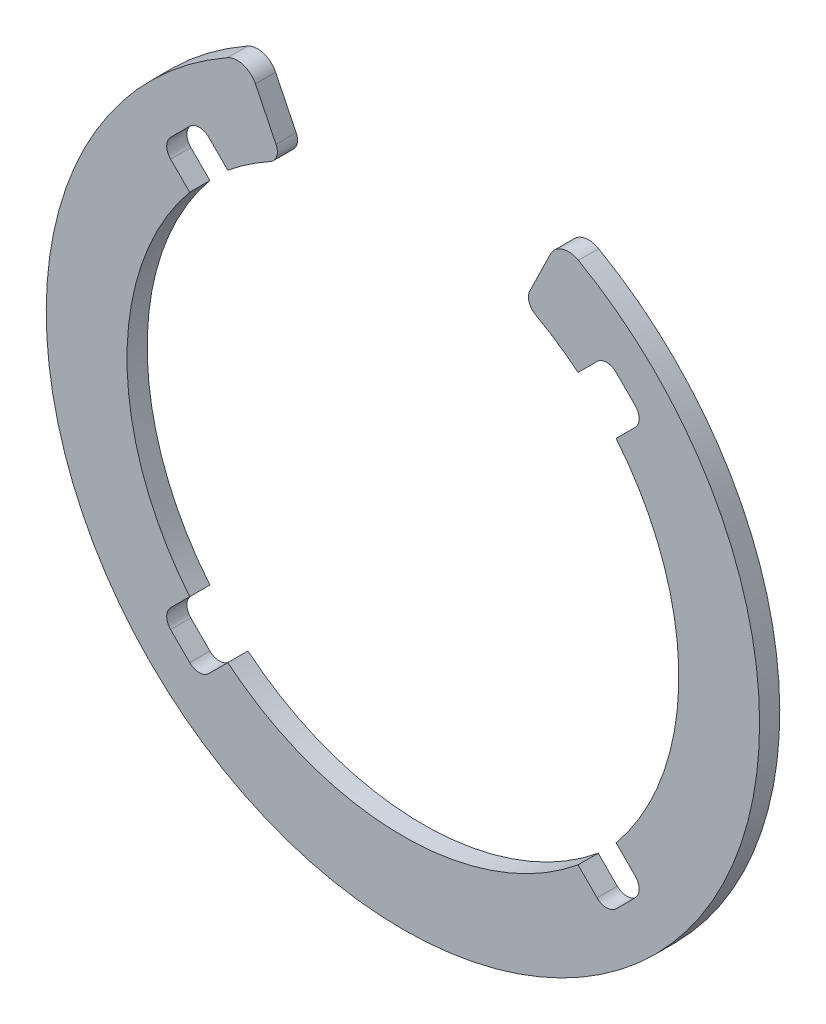
ISO-10303-21;
HEADER;
FILE_DESCRIPTION(('STEP AP214'),'2;1');
FILE_NAME('part.step','',(''),(''),'','','');
FILE_SCHEMA(('AUTOMOTIVE_DESIGN { 1 0 10303 214 1 1 1 1 }'));
ENDSEC;
DATA;
#1=APPLICATION_CONTEXT('core data for automotive mechanical design processes');
#2=APPLICATION_PROTOCOL_DEFINITION('international standard','automotive_design',2000,#1);
#3=PRODUCT_CONTEXT('',#1,'mechanical');
#4=PRODUCT('Part','Part','',(#3));
#5=PRODUCT_RELATED_PRODUCT_CATEGORY('part','',(#4));
#6=PRODUCT_DEFINITION_FORMATION('','',#4);
#7=PRODUCT_DEFINITION_CONTEXT('part definition',#1,'design');
#8=PRODUCT_DEFINITION('design','',#6,#7);
#9=PRODUCT_DEFINITION_SHAPE('','',#8);
#10=(LENGTH_UNIT() NAMED_UNIT(*) SI_UNIT(.MILLI.,.METRE.));
#11=(NAMED_UNIT(*) PLANE_ANGLE_UNIT() SI_UNIT($,.RADIAN.));
#12=(NAMED_UNIT(*) SI_UNIT($,.STERADIAN.) SOLID_ANGLE_UNIT());
#13=UNCERTAINTY_MEASURE_WITH_UNIT(LENGTH_MEASURE(1.E-05),#10,'distance_accuracy_value','');
#14=(GEOMETRIC_REPRESENTATION_CONTEXT(3) GLOBAL_UNCERTAINTY_ASSIGNED_CONTEXT((#13)) GLOBAL_UNIT_ASSIGNED_CONTEXT((#10,
#11,#12)) REPRESENTATION_CONTEXT('',''));
#15=CARTESIAN_POINT('',(0.,0.,0.));
#16=DIRECTION('',(0.,0.,1.));
#17=DIRECTION('',(1.,0.,0.));
#18=AXIS2_PLACEMENT_3D('',#15,#16,#17);
#19=CARTESIAN_POINT('',(0.,0.,3.));
#20=DIRECTION('',(0.,0.,-1.));
#21=DIRECTION('',(-1.,0.,0.));
#22=AXIS2_PLACEMENT_3D('',#19,#20,#21);
#23=CYLINDRICAL_SURFACE('',#22,41.);
#24=CARTESIAN_POINT('',(0.,0.,3.));
#25=DIRECTION('',(0.,0.,1.));
#26=DIRECTION('',(1.,0.,0.));
#27=AXIS2_PLACEMENT_3D('',#24,#25,#26);
#28=CIRCLE('',#27,41.);
#29=CARTESIAN_POINT('',(26.0246489677607,31.6815032172533,3.));
#30=VERTEX_POINT('',#29);
#31=CARTESIAN_POINT('',(19.6938906800581,35.9604041951967,3.));
#32=VERTEX_POINT('',#31);
#33=EDGE_CURVE('E280',#30,#32,#28,.T.);
#34=ORIENTED_EDGE('',*,*,#33,.T.);
#35=DIRECTION('',(0.,0.,-1.));
#36=VECTOR('',#35,1.);
#37=CARTESIAN_POINT('',(19.6938906800581,35.9604041951967,3.));
#38=LINE('',#37,#36);
#39=CARTESIAN_POINT('',(19.6938906800581,35.9604041951967,0.));
#40=VERTEX_POINT('',#39);
#41=EDGE_CURVE('E362',#32,#40,#38,.T.);
#42=ORIENTED_EDGE('',*,*,#41,.T.);
#43=CARTESIAN_POINT('',(0.,0.,0.));
#44=DIRECTION('',(0.,0.,1.));
#45=DIRECTION('',(1.,0.,0.));
#46=AXIS2_PLACEMENT_3D('',#43,#44,#45);
#47=CIRCLE('',#46,41.);
#48=CARTESIAN_POINT('',(26.0246489677607,31.6815032172533,0.));
#49=VERTEX_POINT('',#48);
#50=EDGE_CURVE('E277',#49,#40,#47,.T.);
#51=ORIENTED_EDGE('',*,*,#50,.F.);
#52=DIRECTION('',(0.,0.,1.));
#53=VECTOR('',#52,1.);
#54=CARTESIAN_POINT('',(26.0246489677607,31.6815032172533,0.));
#55=LINE('',#54,#53);
#56=EDGE_CURVE('E426',#49,#30,#55,.T.);
#57=ORIENTED_EDGE('',*,*,#56,.T.);
#58=EDGE_LOOP('',(#34,#42,#51,#57));
#59=FACE_BOUND('',#58,.T.);
#60=ADVANCED_FACE('F33',(#59),#23,.F.);
#61=CARTESIAN_POINT('',(-19.6938906800581,35.9604041951967,0.));
#62=VERTEX_POINT('',#61);
#63=CARTESIAN_POINT('',(-26.0246489677607,31.6815032172533,0.));
#64=VERTEX_POINT('',#63);
#65=EDGE_CURVE('E275',#62,#64,#47,.T.);
#66=ORIENTED_EDGE('',*,*,#65,.F.);
#67=DIRECTION('',(0.,0.,-1.));
#68=VECTOR('',#67,1.);
#69=CARTESIAN_POINT('',(-19.6938906800581,35.9604041951967,3.));
#70=LINE('',#69,#68);
#71=CARTESIAN_POINT('',(-19.6938906800581,35.9604041951967,3.));
#72=VERTEX_POINT('',#71);
#73=EDGE_CURVE('E367',#62,#72,#70,.F.);
#74=ORIENTED_EDGE('',*,*,#73,.T.);
#75=CARTESIAN_POINT('',(-26.0246489677607,31.6815032172533,3.));
#76=VERTEX_POINT('',#75);
#77=EDGE_CURVE('E290',#72,#76,#28,.T.);
#78=ORIENTED_EDGE('',*,*,#77,.T.);
#79=DIRECTION('',(0.,0.,1.));
#80=VECTOR('',#79,1.);
#81=CARTESIAN_POINT('',(-26.0246489677607,31.6815032172533,0.));
#82=LINE('',#81,#80);
#83=EDGE_CURVE('E507',#64,#76,#82,.T.);
#84=ORIENTED_EDGE('',*,*,#83,.F.);
#85=EDGE_LOOP('',(#66,#74,#78,#84));
#86=FACE_BOUND('',#85,.T.);
#87=ADVANCED_FACE('F497',(#86),#23,.F.);
#88=DIRECTION('',(0.,0.,1.));
#89=VECTOR('',#88,1.);
#90=CARTESIAN_POINT('',(-26.0246489677607,-31.6815032172533,0.));
#91=LINE('',#90,#89);
#92=CARTESIAN_POINT('',(-26.0246489677607,-31.6815032172533,0.));
#93=VERTEX_POINT('',#92);
#94=CARTESIAN_POINT('',(-26.0246489677607,-31.6815032172533,3.));
#95=VERTEX_POINT('',#94);
#96=EDGE_CURVE('E259',#93,#95,#91,.T.);
#97=ORIENTED_EDGE('',*,*,#96,.T.);
#98=CARTESIAN_POINT('',(26.0246489677607,-31.6815032172533,3.));
#99=VERTEX_POINT('',#98);
#100=EDGE_CURVE('E546',#95,#99,#28,.T.);
#101=ORIENTED_EDGE('',*,*,#100,.T.);
#102=DIRECTION('',(0.,0.,1.));
#103=VECTOR('',#102,1.);
#104=CARTESIAN_POINT('',(26.0246489677607,-31.6815032172533,0.));
#105=LINE('',#104,#103);
#106=CARTESIAN_POINT('',(26.0246489677607,-31.6815032172533,0.));
#107=VERTEX_POINT('',#106);
#108=EDGE_CURVE('E270',#107,#99,#105,.T.);
#109=ORIENTED_EDGE('',*,*,#108,.F.);
#110=EDGE_CURVE('E248',#93,#107,#47,.T.);
#111=ORIENTED_EDGE('',*,*,#110,.F.);
#112=EDGE_LOOP('',(#97,#101,#109,#111));
#113=FACE_BOUND('',#112,.T.);
#114=ADVANCED_FACE('F269',(#113),#23,.F.);
#115=DIRECTION('',(0.,0.,1.));
#116=VECTOR('',#115,1.);
#117=CARTESIAN_POINT('',(31.6815032172532,26.0246489677608,0.));
#118=LINE('',#117,#116);
#119=CARTESIAN_POINT('',(31.6815032172532,26.0246489677608,0.));
#120=VERTEX_POINT('',#119);
#121=CARTESIAN_POINT('',(31.6815032172532,26.0246489677608,3.));
#122=VERTEX_POINT('',#121);
#123=EDGE_CURVE('E428',#120,#122,#118,.T.);
#124=ORIENTED_EDGE('',*,*,#123,.F.);
#125=CARTESIAN_POINT('',(31.6815032172532,-26.0246489677608,0.));
#126=VERTEX_POINT('',#125);
#127=EDGE_CURVE('E272',#126,#120,#47,.T.);
#128=ORIENTED_EDGE('',*,*,#127,.F.);
#129=DIRECTION('',(0.,0.,1.));
#130=VECTOR('',#129,1.);
#131=CARTESIAN_POINT('',(31.6815032172532,-26.0246489677608,0.));
#132=LINE('',#131,#130);
#133=CARTESIAN_POINT('',(31.6815032172532,-26.0246489677608,3.));
#134=VERTEX_POINT('',#133);
#135=EDGE_CURVE('E443',#126,#134,#132,.T.);
#136=ORIENTED_EDGE('',*,*,#135,.T.);
#137=EDGE_CURVE('E543',#134,#122,#28,.T.);
#138=ORIENTED_EDGE('',*,*,#137,.T.);
#139=EDGE_LOOP('',(#124,#128,#136,#138));
#140=FACE_BOUND('',#139,.T.);
#141=ADVANCED_FACE('F542',(#140),#23,.F.);
#142=CARTESIAN_POINT('',(0.,0.,3.));
#143=DIRECTION('',(0.,0.,1.));
#144=DIRECTION('',(1.,0.,0.));
#145=AXIS2_PLACEMENT_3D('',#142,#143,#144);
#146=PLANE('',#145);
#147=DIRECTION('',(0.439024390243903,0.898475144214335,0.));
#148=VECTOR('',#147,1.);
#149=CARTESIAN_POINT('',(18.,36.8374809127877,3.));
#150=LINE('',#149,#148);
#151=CARTESIAN_POINT('',(18.8576179857786,38.5926190339868,3.));
#152=VERTEX_POINT('',#151);
#153=CARTESIAN_POINT('',(21.9116716919434,44.8428215399576,3.));
#154=VERTEX_POINT('',#153);
#155=EDGE_CURVE('E295',#152,#154,#150,.T.);
#156=ORIENTED_EDGE('',*,*,#155,.F.);
#157=CARTESIAN_POINT('',(20.6545682742073,37.714570253499,3.));
#158=DIRECTION('',(0.,0.,1.));
#159=DIRECTION('',(1.,0.,0.));
#160=AXIS2_PLACEMENT_3D('',#157,#158,#159);
#161=CIRCLE('',#160,2.);
#162=EDGE_CURVE('E360',#152,#32,#161,.T.);
#163=ORIENTED_EDGE('',*,*,#162,.T.);
#164=ORIENTED_EDGE('',*,*,#33,.F.);
#165=DIRECTION('',(-0.707106781186564,-0.707106781186531,0.));
#166=VECTOR('',#165,1.);
#167=CARTESIAN_POINT('',(-2.8284271247469,2.82842712474703,3.));
#168=LINE('',#167,#166);
#169=CARTESIAN_POINT('',(28.853076092507,34.5099303419995,3.));
#170=VERTEX_POINT('',#169);
#171=EDGE_CURVE('E405',#170,#30,#168,.T.);
#172=ORIENTED_EDGE('',*,*,#171,.F.);
#173=CARTESIAN_POINT('',(30.26728965488,33.0957167796263,3.));
#174=DIRECTION('',(0.,0.,1.));
#175=DIRECTION('',(1.,0.,0.));
#176=AXIS2_PLACEMENT_3D('',#173,#174,#175);
#177=CIRCLE('',#176,2.);
#178=CARTESIAN_POINT('',(31.6815032172531,34.5099303419994,3.));
#179=VERTEX_POINT('',#178);
#180=EDGE_CURVE('E41',#170,#179,#177,.F.);
#181=ORIENTED_EDGE('',*,*,#180,.T.);
#182=DIRECTION('',(-0.70710678118655,0.707106781186545,0.));
#183=VECTOR('',#182,1.);
#184=CARTESIAN_POINT('',(33.0957167796262,33.0957167796264,3.));
#185=LINE('',#184,#183);
#186=CARTESIAN_POINT('',(34.5099303419994,31.6815032172532,3.));
#187=VERTEX_POINT('',#186);
#188=EDGE_CURVE('E403',#187,#179,#185,.T.);
#189=ORIENTED_EDGE('',*,*,#188,.F.);
#190=CARTESIAN_POINT('',(33.0957167796263,30.2672896548801,3.));
#191=DIRECTION('',(0.,0.,1.));
#192=DIRECTION('',(1.,0.,0.));
#193=AXIS2_PLACEMENT_3D('',#190,#191,#192);
#194=CIRCLE('',#193,2.);
#195=CARTESIAN_POINT('',(34.5099303419994,28.853076092507,3.));
#196=VERTEX_POINT('',#195);
#197=EDGE_CURVE('E394',#187,#196,#194,.F.);
#198=ORIENTED_EDGE('',*,*,#197,.T.);
#199=DIRECTION('',(0.707106781186544,0.707106781186551,0.));
#200=VECTOR('',#199,1.);
#201=CARTESIAN_POINT('',(2.82842712474634,-2.82842712474631,3.));
#202=LINE('',#201,#200);
#203=EDGE_CURVE('E461',#122,#196,#202,.T.);
#204=ORIENTED_EDGE('',*,*,#203,.F.);
#205=ORIENTED_EDGE('',*,*,#137,.F.);
#206=DIRECTION('',(-0.707106781186547,0.707106781186548,0.));
#207=VECTOR('',#206,1.);
#208=CARTESIAN_POINT('',(2.82842712474622,2.82842712474621,3.));
#209=LINE('',#208,#207);
#210=CARTESIAN_POINT('',(34.5099303419994,-28.853076092507,3.));
#211=VERTEX_POINT('',#210);
#212=EDGE_CURVE('E450',#211,#134,#209,.T.);
#213=ORIENTED_EDGE('',*,*,#212,.F.);
#214=CARTESIAN_POINT('',(33.0957167796263,-30.2672896548801,3.));
#215=DIRECTION('',(0.,0.,1.));
#216=DIRECTION('',(1.,0.,0.));
#217=AXIS2_PLACEMENT_3D('',#214,#215,#216);
#218=CIRCLE('',#217,2.);
#219=CARTESIAN_POINT('',(34.5099303419994,-31.6815032172532,3.));
#220=VERTEX_POINT('',#219);
#221=EDGE_CURVE('E375',#211,#220,#218,.F.);
#222=ORIENTED_EDGE('',*,*,#221,.T.);
#223=DIRECTION('',(0.70710678118655,0.707106781186545,0.));
#224=VECTOR('',#223,1.);
#225=CARTESIAN_POINT('',(33.0957167796262,-33.0957167796264,3.));
#226=LINE('',#225,#224);
#227=CARTESIAN_POINT('',(31.6815032172532,-34.5099303419994,3.));
#228=VERTEX_POINT('',#227);
#229=EDGE_CURVE('E465',#228,#220,#226,.T.);
#230=ORIENTED_EDGE('',*,*,#229,.F.);
#231=CARTESIAN_POINT('',(30.2672896548801,-33.0957167796263,3.));
#232=DIRECTION('',(0.,0.,1.));
#233=DIRECTION('',(1.,0.,0.));
#234=AXIS2_PLACEMENT_3D('',#231,#232,#233);
#235=CIRCLE('',#234,2.);
#236=CARTESIAN_POINT('',(28.853076092507,-34.5099303419995,3.));
#237=VERTEX_POINT('',#236);
#238=EDGE_CURVE('E371',#228,#237,#235,.F.);
#239=ORIENTED_EDGE('',*,*,#238,.T.);
#240=DIRECTION('',(0.707106781186564,-0.707106781186531,0.));
#241=VECTOR('',#240,1.);
#242=CARTESIAN_POINT('',(-2.82842712474689,-2.82842712474702,3.));
#243=LINE('',#242,#241);
#244=EDGE_CURVE('E445',#99,#237,#243,.T.);
#245=ORIENTED_EDGE('',*,*,#244,.F.);
#246=ORIENTED_EDGE('',*,*,#100,.F.);
#247=DIRECTION('',(0.707106781186564,0.707106781186531,0.));
#248=VECTOR('',#247,1.);
#249=CARTESIAN_POINT('',(2.82842712474689,-2.82842712474702,3.));
#250=LINE('',#249,#248);
#251=CARTESIAN_POINT('',(-28.853076092507,-34.5099303419995,3.));
#252=VERTEX_POINT('',#251);
#253=EDGE_CURVE('E262',#252,#95,#250,.T.);
#254=ORIENTED_EDGE('',*,*,#253,.F.);
#255=CARTESIAN_POINT('',(-30.2672896548801,-33.0957167796263,3.));
#256=DIRECTION('',(0.,0.,1.));
#257=DIRECTION('',(1.,0.,0.));
#258=AXIS2_PLACEMENT_3D('',#255,#256,#257);
#259=CIRCLE('',#258,2.);
#260=CARTESIAN_POINT('',(-31.6815032172531,-34.5099303419994,3.));
#261=VERTEX_POINT('',#260);
#262=EDGE_CURVE('E379',#252,#261,#259,.F.);
#263=ORIENTED_EDGE('',*,*,#262,.T.);
#264=DIRECTION('',(0.70710678118655,-0.707106781186545,0.));
#265=VECTOR('',#264,1.);
#266=CARTESIAN_POINT('',(-33.0957167796262,-33.0957167796264,3.));
#267=LINE('',#266,#265);
#268=CARTESIAN_POINT('',(-34.5099303419994,-31.6815032172532,3.));
#269=VERTEX_POINT('',#268);
#270=EDGE_CURVE('E468',#269,#261,#267,.T.);
#271=ORIENTED_EDGE('',*,*,#270,.F.);
#272=CARTESIAN_POINT('',(-33.0957167796263,-30.2672896548801,3.));
#273=DIRECTION('',(0.,0.,1.));
#274=DIRECTION('',(1.,0.,0.));
#275=AXIS2_PLACEMENT_3D('',#272,#273,#274);
#276=CIRCLE('',#275,2.);
#277=CARTESIAN_POINT('',(-34.5099303419994,-28.853076092507,3.));
#278=VERTEX_POINT('',#277);
#279=EDGE_CURVE('E382',#269,#278,#276,.F.);
#280=ORIENTED_EDGE('',*,*,#279,.T.);
#281=DIRECTION('',(-0.707106781186546,-0.70710678118655,0.));
#282=VECTOR('',#281,1.);
#283=CARTESIAN_POINT('',(-2.82842712474628,2.82842712474626,3.));
#284=LINE('',#283,#282);
#285=CARTESIAN_POINT('',(-31.6815032172532,-26.0246489677608,3.));
#286=VERTEX_POINT('',#285);
#287=EDGE_CURVE('E452',#286,#278,#284,.T.);
#288=ORIENTED_EDGE('',*,*,#287,.F.);
#289=CARTESIAN_POINT('',(-31.6815032172532,26.0246489677608,3.));
#290=VERTEX_POINT('',#289);
#291=EDGE_CURVE('E292',#290,#286,#28,.T.);
#292=ORIENTED_EDGE('',*,*,#291,.F.);
#293=DIRECTION('',(0.707106781186546,-0.70710678118655,0.));
#294=VECTOR('',#293,1.);
#295=CARTESIAN_POINT('',(-2.82842712474628,-2.82842712474626,3.));
#296=LINE('',#295,#294);
#297=CARTESIAN_POINT('',(-34.5099303419994,28.853076092507,3.));
#298=VERTEX_POINT('',#297);
#299=EDGE_CURVE('E456',#298,#290,#296,.T.);
#300=ORIENTED_EDGE('',*,*,#299,.F.);
#301=CARTESIAN_POINT('',(-33.0957167796263,30.2672896548801,3.));
#302=DIRECTION('',(0.,0.,1.));
#303=DIRECTION('',(1.,0.,0.));
#304=AXIS2_PLACEMENT_3D('',#301,#302,#303);
#305=CIRCLE('',#304,2.);
#306=CARTESIAN_POINT('',(-34.5099303419994,31.6815032172532,3.));
#307=VERTEX_POINT('',#306);
#308=EDGE_CURVE('E386',#298,#307,#305,.F.);
#309=ORIENTED_EDGE('',*,*,#308,.T.);
#310=DIRECTION('',(-0.70710678118655,-0.707106781186545,0.));
#311=VECTOR('',#310,1.);
#312=CARTESIAN_POINT('',(-33.0957167796262,33.0957167796264,3.));
#313=LINE('',#312,#311);
#314=CARTESIAN_POINT('',(-31.6815032172531,34.5099303419994,3.));
#315=VERTEX_POINT('',#314);
#316=EDGE_CURVE('E415',#315,#307,#313,.T.);
#317=ORIENTED_EDGE('',*,*,#316,.F.);
#318=CARTESIAN_POINT('',(-30.2672896548801,33.0957167796263,3.));
#319=DIRECTION('',(0.,0.,1.));
#320=DIRECTION('',(1.,0.,0.));
#321=AXIS2_PLACEMENT_3D('',#318,#319,#320);
#322=CIRCLE('',#321,2.);
#323=CARTESIAN_POINT('',(-28.853076092507,34.5099303419995,3.));
#324=VERTEX_POINT('',#323);
#325=EDGE_CURVE('E390',#315,#324,#322,.F.);
#326=ORIENTED_EDGE('',*,*,#325,.T.);
#327=DIRECTION('',(-0.707106781186564,0.707106781186531,0.));
#328=VECTOR('',#327,1.);
#329=CARTESIAN_POINT('',(2.82842712474689,2.82842712474702,3.));
#330=LINE('',#329,#328);
#331=EDGE_CURVE('E458',#76,#324,#330,.T.);
#332=ORIENTED_EDGE('',*,*,#331,.F.);
#333=ORIENTED_EDGE('',*,*,#77,.F.);
#334=CARTESIAN_POINT('',(-20.6545682742073,37.714570253499,3.));
#335=DIRECTION('',(0.,0.,1.));
#336=DIRECTION('',(1.,0.,0.));
#337=AXIS2_PLACEMENT_3D('',#334,#335,#336);
#338=CIRCLE('',#337,2.);
#339=CARTESIAN_POINT('',(-18.8576179857786,38.5926190339868,3.));
#340=VERTEX_POINT('',#339);
#341=EDGE_CURVE('E358',#72,#340,#338,.T.);
#342=ORIENTED_EDGE('',*,*,#341,.T.);
#343=DIRECTION('',(0.439024390243903,-0.898475144214335,0.));
#344=VECTOR('',#343,1.);
#345=CARTESIAN_POINT('',(-18.,36.8374809127877,3.));
#346=LINE('',#345,#344);
#347=CARTESIAN_POINT('',(-21.9116716919434,44.8428215399576,3.));
#348=VERTEX_POINT('',#347);
#349=EDGE_CURVE('E293',#348,#340,#346,.T.);
#350=ORIENTED_EDGE('',*,*,#349,.F.);
#351=CARTESIAN_POINT('',(-24.6070971245864,43.5257483692259,3.));
#352=DIRECTION('',(0.,0.,1.));
#353=DIRECTION('',(1.,0.,0.));
#354=AXIS2_PLACEMENT_3D('',#351,#352,#353);
#355=CIRCLE('',#354,3.);
#356=CARTESIAN_POINT('',(-26.0835229520616,46.1372932713795,3.));
#357=VERTEX_POINT('',#356);
#358=EDGE_CURVE('E301',#348,#357,#355,.T.);
#359=ORIENTED_EDGE('',*,*,#358,.T.);
#360=CARTESIAN_POINT('',(0.,0.,3.));
#361=DIRECTION('',(0.,0.,1.));
#362=DIRECTION('',(1.,0.,0.));
#363=AXIS2_PLACEMENT_3D('',#360,#361,#362);
#364=CIRCLE('',#363,53.);
#365=CARTESIAN_POINT('',(26.0835229520616,46.1372932713795,3.));
#366=VERTEX_POINT('',#365);
#367=EDGE_CURVE('E283',#357,#366,#364,.T.);
#368=ORIENTED_EDGE('',*,*,#367,.T.);
#369=CARTESIAN_POINT('',(24.6070971245864,43.5257483692259,3.));
#370=DIRECTION('',(0.,0.,1.));
#371=DIRECTION('',(1.,0.,0.));
#372=AXIS2_PLACEMENT_3D('',#369,#370,#371);
#373=CIRCLE('',#372,3.);
#374=EDGE_CURVE('E303',#366,#154,#373,.T.);
#375=ORIENTED_EDGE('',*,*,#374,.T.);
#376=EDGE_LOOP('',(#156,#163,#164,#172,#181,#189,#198,#204,#205,#213,#222,#230,#239,#245,#246,
#254,#263,#271,#280,#288,#292,#300,#309,#317,#326,#332,#333,#342,#350,#359,#368,#375));
#377=FACE_BOUND('',#376,.T.);
#378=ADVANCED_FACE('F402',(#377),#146,.T.);
#379=CARTESIAN_POINT('',(0.,0.,0.));
#380=DIRECTION('',(0.,0.,1.));
#381=DIRECTION('',(1.,0.,0.));
#382=AXIS2_PLACEMENT_3D('',#379,#380,#381);
#383=PLANE('',#382);
#384=ORIENTED_EDGE('',*,*,#50,.T.);
#385=CARTESIAN_POINT('',(20.6545682742073,37.714570253499,0.));
#386=DIRECTION('',(0.,0.,1.));
#387=DIRECTION('',(1.,0.,0.));
#388=AXIS2_PLACEMENT_3D('',#385,#386,#387);
#389=CIRCLE('',#388,2.);
#390=CARTESIAN_POINT('',(18.8576179857786,38.5926190339868,0.));
#391=VERTEX_POINT('',#390);
#392=EDGE_CURVE('E365',#40,#391,#389,.F.);
#393=ORIENTED_EDGE('',*,*,#392,.T.);
#394=DIRECTION('',(0.439024390243902,0.898475144214335,0.));
#395=VECTOR('',#394,1.);
#396=CARTESIAN_POINT('',(18.,36.8374809127877,0.));
#397=LINE('',#396,#395);
#398=CARTESIAN_POINT('',(21.9116716919434,44.8428215399576,0.));
#399=VERTEX_POINT('',#398);
#400=EDGE_CURVE('E281',#391,#399,#397,.T.);
#401=ORIENTED_EDGE('',*,*,#400,.T.);
#402=CARTESIAN_POINT('',(24.6070971245864,43.5257483692259,0.));
#403=DIRECTION('',(0.,0.,1.));
#404=DIRECTION('',(1.,0.,0.));
#405=AXIS2_PLACEMENT_3D('',#402,#403,#404);
#406=CIRCLE('',#405,3.);
#407=CARTESIAN_POINT('',(26.0835229520616,46.1372932713795,0.));
#408=VERTEX_POINT('',#407);
#409=EDGE_CURVE('E311',#399,#408,#406,.F.);
#410=ORIENTED_EDGE('',*,*,#409,.T.);
#411=CARTESIAN_POINT('',(0.,0.,0.));
#412=DIRECTION('',(0.,0.,1.));
#413=DIRECTION('',(1.,0.,0.));
#414=AXIS2_PLACEMENT_3D('',#411,#412,#413);
#415=CIRCLE('',#414,53.);
#416=CARTESIAN_POINT('',(-26.0835229520616,46.1372932713795,0.));
#417=VERTEX_POINT('',#416);
#418=EDGE_CURVE('E287',#417,#408,#415,.T.);
#419=ORIENTED_EDGE('',*,*,#418,.F.);
#420=CARTESIAN_POINT('',(-24.6070971245864,43.5257483692259,0.));
#421=DIRECTION('',(0.,0.,1.));
#422=DIRECTION('',(1.,0.,0.));
#423=AXIS2_PLACEMENT_3D('',#420,#421,#422);
#424=CIRCLE('',#423,3.);
#425=CARTESIAN_POINT('',(-21.9116716919434,44.8428215399576,0.));
#426=VERTEX_POINT('',#425);
#427=EDGE_CURVE('E309',#417,#426,#424,.F.);
#428=ORIENTED_EDGE('',*,*,#427,.T.);
#429=DIRECTION('',(0.439024390243902,-0.898475144214335,0.));
#430=VECTOR('',#429,1.);
#431=CARTESIAN_POINT('',(-18.,36.8374809127877,0.));
#432=LINE('',#431,#430);
#433=CARTESIAN_POINT('',(-18.8576179857786,38.5926190339868,0.));
#434=VERTEX_POINT('',#433);
#435=EDGE_CURVE('E414',#426,#434,#432,.T.);
#436=ORIENTED_EDGE('',*,*,#435,.T.);
#437=CARTESIAN_POINT('',(-20.6545682742073,37.714570253499,0.));
#438=DIRECTION('',(0.,0.,1.));
#439=DIRECTION('',(1.,0.,0.));
#440=AXIS2_PLACEMENT_3D('',#437,#438,#439);
#441=CIRCLE('',#440,2.);
#442=EDGE_CURVE('E48',#434,#62,#441,.F.);
#443=ORIENTED_EDGE('',*,*,#442,.T.);
#444=ORIENTED_EDGE('',*,*,#65,.T.);
#445=DIRECTION('',(-0.707106781186564,0.707106781186531,0.));
#446=VECTOR('',#445,1.);
#447=CARTESIAN_POINT('',(-26.0246489677607,31.6815032172533,0.));
#448=LINE('',#447,#446);
#449=CARTESIAN_POINT('',(-28.853076092507,34.5099303419995,0.));
#450=VERTEX_POINT('',#449);
#451=EDGE_CURVE('E435',#64,#450,#448,.T.);
#452=ORIENTED_EDGE('',*,*,#451,.T.);
#453=CARTESIAN_POINT('',(-30.2672896548801,33.0957167796263,0.));
#454=DIRECTION('',(0.,0.,1.));
#455=DIRECTION('',(1.,0.,0.));
#456=AXIS2_PLACEMENT_3D('',#453,#454,#455);
#457=CIRCLE('',#456,2.);
#458=CARTESIAN_POINT('',(-31.6815032172531,34.5099303419994,0.));
#459=VERTEX_POINT('',#458);
#460=EDGE_CURVE('E392',#450,#459,#457,.T.);
#461=ORIENTED_EDGE('',*,*,#460,.T.);
#462=DIRECTION('',(-0.70710678118655,-0.707106781186545,0.));
#463=VECTOR('',#462,1.);
#464=CARTESIAN_POINT('',(-35.9241439043725,30.2672896548801,0.));
#465=LINE('',#464,#463);
#466=CARTESIAN_POINT('',(-34.5099303419994,31.6815032172532,0.));
#467=VERTEX_POINT('',#466);
#468=EDGE_CURVE('E514',#459,#467,#465,.T.);
#469=ORIENTED_EDGE('',*,*,#468,.T.);
#470=CARTESIAN_POINT('',(-33.0957167796263,30.2672896548801,0.));
#471=DIRECTION('',(0.,0.,1.));
#472=DIRECTION('',(1.,0.,0.));
#473=AXIS2_PLACEMENT_3D('',#470,#471,#472);
#474=CIRCLE('',#473,2.);
#475=CARTESIAN_POINT('',(-34.5099303419994,28.853076092507,0.));
#476=VERTEX_POINT('',#475);
#477=EDGE_CURVE('E388',#467,#476,#474,.T.);
#478=ORIENTED_EDGE('',*,*,#477,.T.);
#479=DIRECTION('',(0.707106781186545,-0.707106781186549,0.));
#480=VECTOR('',#479,1.);
#481=CARTESIAN_POINT('',(-31.6815032172532,26.0246489677608,0.));
#482=LINE('',#481,#480);
#483=CARTESIAN_POINT('',(-31.6815032172532,26.0246489677608,0.));
#484=VERTEX_POINT('',#483);
#485=EDGE_CURVE('E519',#476,#484,#482,.T.);
#486=ORIENTED_EDGE('',*,*,#485,.T.);
#487=CARTESIAN_POINT('',(-31.6815032172532,-26.0246489677608,0.));
#488=VERTEX_POINT('',#487);
#489=EDGE_CURVE('E271',#484,#488,#47,.T.);
#490=ORIENTED_EDGE('',*,*,#489,.T.);
#491=DIRECTION('',(-0.707106781186545,-0.707106781186549,0.));
#492=VECTOR('',#491,1.);
#493=CARTESIAN_POINT('',(-31.6815032172532,-26.0246489677608,0.));
#494=LINE('',#493,#492);
#495=CARTESIAN_POINT('',(-34.5099303419994,-28.853076092507,0.));
#496=VERTEX_POINT('',#495);
#497=EDGE_CURVE('E527',#488,#496,#494,.T.);
#498=ORIENTED_EDGE('',*,*,#497,.T.);
#499=CARTESIAN_POINT('',(-33.0957167796263,-30.2672896548801,0.));
#500=DIRECTION('',(0.,0.,1.));
#501=DIRECTION('',(1.,0.,0.));
#502=AXIS2_PLACEMENT_3D('',#499,#500,#501);
#503=CIRCLE('',#502,2.);
#504=CARTESIAN_POINT('',(-34.5099303419994,-31.6815032172532,0.));
#505=VERTEX_POINT('',#504);
#506=EDGE_CURVE('E384',#496,#505,#503,.T.);
#507=ORIENTED_EDGE('',*,*,#506,.T.);
#508=DIRECTION('',(0.70710678118655,-0.707106781186545,0.));
#509=VECTOR('',#508,1.);
#510=CARTESIAN_POINT('',(-35.9241439043725,-30.2672896548801,0.));
#511=LINE('',#510,#509);
#512=CARTESIAN_POINT('',(-31.6815032172531,-34.5099303419994,0.));
#513=VERTEX_POINT('',#512);
#514=EDGE_CURVE('E256',#505,#513,#511,.T.);
#515=ORIENTED_EDGE('',*,*,#514,.T.);
#516=CARTESIAN_POINT('',(-30.2672896548801,-33.0957167796263,0.));
#517=DIRECTION('',(0.,0.,1.));
#518=DIRECTION('',(1.,0.,0.));
#519=AXIS2_PLACEMENT_3D('',#516,#517,#518);
#520=CIRCLE('',#519,2.);
#521=CARTESIAN_POINT('',(-28.853076092507,-34.5099303419995,0.));
#522=VERTEX_POINT('',#521);
#523=EDGE_CURVE('E251',#513,#522,#520,.T.);
#524=ORIENTED_EDGE('',*,*,#523,.T.);
#525=DIRECTION('',(0.707106781186564,0.707106781186531,0.));
#526=VECTOR('',#525,1.);
#527=CARTESIAN_POINT('',(-26.0246489677607,-31.6815032172533,0.));
#528=LINE('',#527,#526);
#529=EDGE_CURVE('E242',#522,#93,#528,.T.);
#530=ORIENTED_EDGE('',*,*,#529,.T.);
#531=ORIENTED_EDGE('',*,*,#110,.T.);
#532=DIRECTION('',(0.707106781186564,-0.707106781186531,0.));
#533=VECTOR('',#532,1.);
#534=CARTESIAN_POINT('',(26.0246489677607,-31.6815032172533,0.));
#535=LINE('',#534,#533);
#536=CARTESIAN_POINT('',(28.853076092507,-34.5099303419994,0.));
#537=VERTEX_POINT('',#536);
#538=EDGE_CURVE('E438',#107,#537,#535,.T.);
#539=ORIENTED_EDGE('',*,*,#538,.T.);
#540=CARTESIAN_POINT('',(30.2672896548801,-33.0957167796263,0.));
#541=DIRECTION('',(0.,0.,1.));
#542=DIRECTION('',(1.,0.,0.));
#543=AXIS2_PLACEMENT_3D('',#540,#541,#542);
#544=CIRCLE('',#543,2.);
#545=CARTESIAN_POINT('',(31.6815032172532,-34.5099303419994,0.));
#546=VERTEX_POINT('',#545);
#547=EDGE_CURVE('E373',#537,#546,#544,.T.);
#548=ORIENTED_EDGE('',*,*,#547,.T.);
#549=DIRECTION('',(0.70710678118655,0.707106781186545,0.));
#550=VECTOR('',#549,1.);
#551=CARTESIAN_POINT('',(35.9241439043725,-30.2672896548801,0.));
#552=LINE('',#551,#550);
#553=CARTESIAN_POINT('',(34.5099303419994,-31.6815032172532,0.));
#554=VERTEX_POINT('',#553);
#555=EDGE_CURVE('E440',#546,#554,#552,.T.);
#556=ORIENTED_EDGE('',*,*,#555,.T.);
#557=CARTESIAN_POINT('',(33.0957167796263,-30.2672896548801,0.));
#558=DIRECTION('',(0.,0.,1.));
#559=DIRECTION('',(1.,0.,0.));
#560=AXIS2_PLACEMENT_3D('',#557,#558,#559);
#561=CIRCLE('',#560,2.);
#562=CARTESIAN_POINT('',(34.5099303419994,-28.853076092507,0.));
#563=VERTEX_POINT('',#562);
#564=EDGE_CURVE('E377',#554,#563,#561,.T.);
#565=ORIENTED_EDGE('',*,*,#564,.T.);
#566=DIRECTION('',(-0.707106781186547,0.707106781186548,0.));
#567=VECTOR('',#566,1.);
#568=CARTESIAN_POINT('',(31.6815032172532,-26.0246489677608,0.));
#569=LINE('',#568,#567);
#570=EDGE_CURVE('E266',#563,#126,#569,.T.);
#571=ORIENTED_EDGE('',*,*,#570,.T.);
#572=ORIENTED_EDGE('',*,*,#127,.T.);
#573=DIRECTION('',(0.707106781186544,0.707106781186551,0.));
#574=VECTOR('',#573,1.);
#575=CARTESIAN_POINT('',(31.6815032172532,26.0246489677608,0.));
#576=LINE('',#575,#574);
#577=CARTESIAN_POINT('',(34.5099303419994,28.853076092507,0.));
#578=VERTEX_POINT('',#577);
#579=EDGE_CURVE('E431',#120,#578,#576,.T.);
#580=ORIENTED_EDGE('',*,*,#579,.T.);
#581=CARTESIAN_POINT('',(33.0957167796263,30.2672896548801,0.));
#582=DIRECTION('',(0.,0.,1.));
#583=DIRECTION('',(1.,0.,0.));
#584=AXIS2_PLACEMENT_3D('',#581,#582,#583);
#585=CIRCLE('',#584,2.);
#586=CARTESIAN_POINT('',(34.5099303419994,31.6815032172532,0.));
#587=VERTEX_POINT('',#586);
#588=EDGE_CURVE('E396',#578,#587,#585,.T.);
#589=ORIENTED_EDGE('',*,*,#588,.T.);
#590=DIRECTION('',(-0.70710678118655,0.707106781186545,0.));
#591=VECTOR('',#590,1.);
#592=CARTESIAN_POINT('',(35.9241439043725,30.2672896548801,0.));
#593=LINE('',#592,#591);
#594=CARTESIAN_POINT('',(31.6815032172531,34.5099303419994,0.));
#595=VERTEX_POINT('',#594);
#596=EDGE_CURVE('E422',#587,#595,#593,.T.);
#597=ORIENTED_EDGE('',*,*,#596,.T.);
#598=CARTESIAN_POINT('',(30.26728965488,33.0957167796263,0.));
#599=DIRECTION('',(0.,0.,1.));
#600=DIRECTION('',(1.,0.,0.));
#601=AXIS2_PLACEMENT_3D('',#598,#599,#600);
#602=CIRCLE('',#601,2.);
#603=CARTESIAN_POINT('',(28.853076092507,34.5099303419995,0.));
#604=VERTEX_POINT('',#603);
#605=EDGE_CURVE('E11',#595,#604,#602,.T.);
#606=ORIENTED_EDGE('',*,*,#605,.T.);
#607=DIRECTION('',(-0.707106781186564,-0.707106781186531,0.));
#608=VECTOR('',#607,1.);
#609=CARTESIAN_POINT('',(26.0246489677607,31.6815032172533,0.));
#610=LINE('',#609,#608);
#611=EDGE_CURVE('E420',#604,#49,#610,.T.);
#612=ORIENTED_EDGE('',*,*,#611,.T.);
#613=EDGE_LOOP('',(#384,#393,#401,#410,#419,#428,#436,#443,#444,#452,#461,#469,#478,#486,#490,
#498,#507,#515,#524,#530,#531,#539,#548,#556,#565,#571,#572,#580,#589,#597,#606,#612));
#614=FACE_BOUND('',#613,.T.);
#615=ADVANCED_FACE('F245',(#614),#383,.F.);
#616=CARTESIAN_POINT('',(0.,0.,3.));
#617=DIRECTION('',(0.,0.,-1.));
#618=DIRECTION('',(-1.,0.,0.));
#619=AXIS2_PLACEMENT_3D('',#616,#617,#618);
#620=CYLINDRICAL_SURFACE('',#619,53.);
#621=ORIENTED_EDGE('',*,*,#418,.T.);
#622=DIRECTION('',(0.,0.,-1.));
#623=VECTOR('',#622,1.);
#624=CARTESIAN_POINT('',(26.0835229520616,46.1372932713795,3.));
#625=LINE('',#624,#623);
#626=EDGE_CURVE('E298',#408,#366,#625,.F.);
#627=ORIENTED_EDGE('',*,*,#626,.T.);
#628=ORIENTED_EDGE('',*,*,#367,.F.);
#629=DIRECTION('',(0.,0.,-1.));
#630=VECTOR('',#629,1.);
#631=CARTESIAN_POINT('',(-26.0835229520616,46.1372932713795,3.));
#632=LINE('',#631,#630);
#633=EDGE_CURVE('E286',#357,#417,#632,.T.);
#634=ORIENTED_EDGE('',*,*,#633,.T.);
#635=EDGE_LOOP('',(#621,#627,#628,#634));
#636=FACE_BOUND('',#635,.T.);
#637=ADVANCED_FACE('F485',(#636),#620,.T.);
#638=DIRECTION('',(0.,0.,1.));
#639=VECTOR('',#638,1.);
#640=CARTESIAN_POINT('',(-31.6815032172532,26.0246489677608,0.));
#641=LINE('',#640,#639);
#642=EDGE_CURVE('E521',#484,#290,#641,.T.);
#643=ORIENTED_EDGE('',*,*,#642,.T.);
#644=ORIENTED_EDGE('',*,*,#291,.T.);
#645=DIRECTION('',(0.,0.,1.));
#646=VECTOR('',#645,1.);
#647=CARTESIAN_POINT('',(-31.6815032172532,-26.0246489677608,0.));
#648=LINE('',#647,#646);
#649=EDGE_CURVE('E255',#488,#286,#648,.T.);
#650=ORIENTED_EDGE('',*,*,#649,.F.);
#651=ORIENTED_EDGE('',*,*,#489,.F.);
#652=EDGE_LOOP('',(#643,#644,#650,#651));
#653=FACE_BOUND('',#652,.T.);
#654=ADVANCED_FACE('F560',(#653),#23,.F.);
#655=CARTESIAN_POINT('',(-18.,36.8374809127877,0.));
#656=DIRECTION('',(-0.898475144214335,-0.439024390243902,0.));
#657=DIRECTION('',(0.439024390243903,-0.898475144214335,0.));
#658=AXIS2_PLACEMENT_3D('',#655,#656,#657);
#659=PLANE('',#658);
#660=ORIENTED_EDGE('',*,*,#349,.T.);
#661=DIRECTION('',(0.,0.,1.));
#662=VECTOR('',#661,1.);
#663=CARTESIAN_POINT('',(-18.8576179857786,38.5926190339868,0.));
#664=LINE('',#663,#662);
#665=EDGE_CURVE('E56',#340,#434,#664,.F.);
#666=ORIENTED_EDGE('',*,*,#665,.T.);
#667=ORIENTED_EDGE('',*,*,#435,.F.);
#668=DIRECTION('',(0.,0.,-1.));
#669=VECTOR('',#668,1.);
#670=CARTESIAN_POINT('',(-21.9116716919434,44.8428215399576,0.));
#671=LINE('',#670,#669);
#672=EDGE_CURVE('E313',#426,#348,#671,.F.);
#673=ORIENTED_EDGE('',*,*,#672,.T.);
#674=EDGE_LOOP('',(#660,#666,#667,#673));
#675=FACE_BOUND('',#674,.T.);
#676=ADVANCED_FACE('F492',(#675),#659,.F.);
#677=CARTESIAN_POINT('',(18.,36.8374809127877,0.));
#678=DIRECTION('',(0.898475144214335,-0.439024390243902,0.));
#679=DIRECTION('',(0.439024390243903,0.898475144214335,0.));
#680=AXIS2_PLACEMENT_3D('',#677,#678,#679);
#681=PLANE('',#680);
#682=ORIENTED_EDGE('',*,*,#400,.F.);
#683=DIRECTION('',(0.,0.,1.));
#684=VECTOR('',#683,1.);
#685=CARTESIAN_POINT('',(18.8576179857786,38.5926190339868,3.));
#686=LINE('',#685,#684);
#687=EDGE_CURVE('E355',#391,#152,#686,.T.);
#688=ORIENTED_EDGE('',*,*,#687,.T.);
#689=ORIENTED_EDGE('',*,*,#155,.T.);
#690=DIRECTION('',(0.,0.,-1.));
#691=VECTOR('',#690,1.);
#692=CARTESIAN_POINT('',(21.9116716919434,44.8428215399576,0.));
#693=LINE('',#692,#691);
#694=EDGE_CURVE('E306',#154,#399,#693,.T.);
#695=ORIENTED_EDGE('',*,*,#694,.T.);
#696=EDGE_LOOP('',(#682,#688,#689,#695));
#697=FACE_BOUND('',#696,.T.);
#698=ADVANCED_FACE('F479',(#697),#681,.F.);
#699=CARTESIAN_POINT('',(31.6815032172532,-26.0246489677608,0.));
#700=DIRECTION('',(0.707106781186548,0.707106781186547,0.));
#701=DIRECTION('',(-0.707106781186547,0.707106781186548,0.));
#702=AXIS2_PLACEMENT_3D('',#699,#700,#701);
#703=PLANE('',#702);
#704=ORIENTED_EDGE('',*,*,#570,.F.);
#705=DIRECTION('',(0.,0.,1.));
#706=VECTOR('',#705,1.);
#707=CARTESIAN_POINT('',(34.5099303419994,-28.853076092507,3.));
#708=LINE('',#707,#706);
#709=EDGE_CURVE('E323',#563,#211,#708,.T.);
#710=ORIENTED_EDGE('',*,*,#709,.T.);
#711=ORIENTED_EDGE('',*,*,#212,.T.);
#712=ORIENTED_EDGE('',*,*,#135,.F.);
#713=EDGE_LOOP('',(#704,#710,#711,#712));
#714=FACE_BOUND('',#713,.T.);
#715=ADVANCED_FACE('F618',(#714),#703,.F.);
#716=CARTESIAN_POINT('',(35.9241439043725,-30.2672896548801,0.));
#717=DIRECTION('',(0.707106781186545,-0.70710678118655,0.));
#718=DIRECTION('',(0.70710678118655,0.707106781186545,0.));
#719=AXIS2_PLACEMENT_3D('',#716,#717,#718);
#720=PLANE('',#719);
#721=ORIENTED_EDGE('',*,*,#555,.F.);
#722=DIRECTION('',(0.,0.,1.));
#723=VECTOR('',#722,1.);
#724=CARTESIAN_POINT('',(31.6815032172532,-34.5099303419994,3.));
#725=LINE('',#724,#723);
#726=EDGE_CURVE('E318',#546,#228,#725,.T.);
#727=ORIENTED_EDGE('',*,*,#726,.T.);
#728=ORIENTED_EDGE('',*,*,#229,.T.);
#729=DIRECTION('',(0.,0.,1.));
#730=VECTOR('',#729,1.);
#731=CARTESIAN_POINT('',(34.5099303419994,-31.6815032172532,0.));
#732=LINE('',#731,#730);
#733=EDGE_CURVE('E316',#220,#554,#732,.F.);
#734=ORIENTED_EDGE('',*,*,#733,.T.);
#735=EDGE_LOOP('',(#721,#727,#728,#734));
#736=FACE_BOUND('',#735,.T.);
#737=ADVANCED_FACE('F628',(#736),#720,.F.);
#738=CARTESIAN_POINT('',(26.0246489677607,-31.6815032172533,0.));
#739=DIRECTION('',(-0.707106781186531,-0.707106781186564,0.));
#740=DIRECTION('',(0.707106781186564,-0.707106781186531,0.));
#741=AXIS2_PLACEMENT_3D('',#738,#739,#740);
#742=PLANE('',#741);
#743=ORIENTED_EDGE('',*,*,#244,.T.);
#744=DIRECTION('',(0.,0.,1.));
#745=VECTOR('',#744,1.);
#746=CARTESIAN_POINT('',(28.853076092507,-34.5099303419994,0.));
#747=LINE('',#746,#745);
#748=EDGE_CURVE('E321',#237,#537,#747,.F.);
#749=ORIENTED_EDGE('',*,*,#748,.T.);
#750=ORIENTED_EDGE('',*,*,#538,.F.);
#751=ORIENTED_EDGE('',*,*,#108,.T.);
#752=EDGE_LOOP('',(#743,#749,#750,#751));
#753=FACE_BOUND('',#752,.T.);
#754=ADVANCED_FACE('F638',(#753),#742,.F.);
#755=CARTESIAN_POINT('',(-26.0246489677607,-31.6815032172533,0.));
#756=DIRECTION('',(0.707106781186531,-0.707106781186564,0.));
#757=DIRECTION('',(0.707106781186564,0.707106781186531,0.));
#758=AXIS2_PLACEMENT_3D('',#755,#756,#757);
#759=PLANE('',#758);
#760=ORIENTED_EDGE('',*,*,#529,.F.);
#761=DIRECTION('',(0.,0.,1.));
#762=VECTOR('',#761,1.);
#763=CARTESIAN_POINT('',(-28.853076092507,-34.5099303419995,3.));
#764=LINE('',#763,#762);
#765=EDGE_CURVE('E326',#522,#252,#764,.T.);
#766=ORIENTED_EDGE('',*,*,#765,.T.);
#767=ORIENTED_EDGE('',*,*,#253,.T.);
#768=ORIENTED_EDGE('',*,*,#96,.F.);
#769=EDGE_LOOP('',(#760,#766,#767,#768));
#770=FACE_BOUND('',#769,.T.);
#771=ADVANCED_FACE('F260',(#770),#759,.F.);
#772=CARTESIAN_POINT('',(-35.9241439043725,-30.2672896548801,0.));
#773=DIRECTION('',(-0.707106781186545,-0.70710678118655,0.));
#774=DIRECTION('',(0.70710678118655,-0.707106781186545,0.));
#775=AXIS2_PLACEMENT_3D('',#772,#773,#774);
#776=PLANE('',#775);
#777=ORIENTED_EDGE('',*,*,#270,.T.);
#778=DIRECTION('',(0.,0.,1.));
#779=VECTOR('',#778,1.);
#780=CARTESIAN_POINT('',(-31.6815032172531,-34.5099303419994,0.));
#781=LINE('',#780,#779);
#782=EDGE_CURVE('E331',#261,#513,#781,.F.);
#783=ORIENTED_EDGE('',*,*,#782,.T.);
#784=ORIENTED_EDGE('',*,*,#514,.F.);
#785=DIRECTION('',(0.,0.,1.));
#786=VECTOR('',#785,1.);
#787=CARTESIAN_POINT('',(-34.5099303419994,-31.6815032172532,3.));
#788=LINE('',#787,#786);
#789=EDGE_CURVE('E328',#505,#269,#788,.T.);
#790=ORIENTED_EDGE('',*,*,#789,.T.);
#791=EDGE_LOOP('',(#777,#783,#784,#790));
#792=FACE_BOUND('',#791,.T.);
#793=ADVANCED_FACE('F657',(#792),#776,.F.);
#794=CARTESIAN_POINT('',(-31.6815032172532,-26.0246489677608,0.));
#795=DIRECTION('',(-0.70710678118655,0.707106781186546,0.));
#796=DIRECTION('',(-0.707106781186546,-0.70710678118655,0.));
#797=AXIS2_PLACEMENT_3D('',#794,#795,#796);
#798=PLANE('',#797);
#799=ORIENTED_EDGE('',*,*,#287,.T.);
#800=DIRECTION('',(0.,0.,1.));
#801=VECTOR('',#800,1.);
#802=CARTESIAN_POINT('',(-34.5099303419994,-28.853076092507,0.));
#803=LINE('',#802,#801);
#804=EDGE_CURVE('E333',#278,#496,#803,.F.);
#805=ORIENTED_EDGE('',*,*,#804,.T.);
#806=ORIENTED_EDGE('',*,*,#497,.F.);
#807=ORIENTED_EDGE('',*,*,#649,.T.);
#808=EDGE_LOOP('',(#799,#805,#806,#807));
#809=FACE_BOUND('',#808,.T.);
#810=ADVANCED_FACE('F666',(#809),#798,.F.);
#811=CARTESIAN_POINT('',(-26.0246489677607,31.6815032172533,0.));
#812=DIRECTION('',(0.707106781186531,0.707106781186564,0.));
#813=DIRECTION('',(-0.707106781186564,0.707106781186531,0.));
#814=AXIS2_PLACEMENT_3D('',#811,#812,#813);
#815=PLANE('',#814);
#816=ORIENTED_EDGE('',*,*,#331,.T.);
#817=DIRECTION('',(0.,0.,1.));
#818=VECTOR('',#817,1.);
#819=CARTESIAN_POINT('',(-28.853076092507,34.5099303419995,0.));
#820=LINE('',#819,#818);
#821=EDGE_CURVE('E343',#324,#450,#820,.F.);
#822=ORIENTED_EDGE('',*,*,#821,.T.);
#823=ORIENTED_EDGE('',*,*,#451,.F.);
#824=ORIENTED_EDGE('',*,*,#83,.T.);
#825=EDGE_LOOP('',(#816,#822,#823,#824));
#826=FACE_BOUND('',#825,.T.);
#827=ADVANCED_FACE('F504',(#826),#815,.F.);
#828=CARTESIAN_POINT('',(-31.6815032172532,26.0246489677608,0.));
#829=DIRECTION('',(-0.70710678118655,-0.707106781186546,0.));
#830=DIRECTION('',(0.707106781186546,-0.70710678118655,0.));
#831=AXIS2_PLACEMENT_3D('',#828,#829,#830);
#832=PLANE('',#831);
#833=ORIENTED_EDGE('',*,*,#485,.F.);
#834=DIRECTION('',(0.,0.,1.));
#835=VECTOR('',#834,1.);
#836=CARTESIAN_POINT('',(-34.5099303419994,28.853076092507,3.));
#837=LINE('',#836,#835);
#838=EDGE_CURVE('E335',#476,#298,#837,.T.);
#839=ORIENTED_EDGE('',*,*,#838,.T.);
#840=ORIENTED_EDGE('',*,*,#299,.T.);
#841=ORIENTED_EDGE('',*,*,#642,.F.);
#842=EDGE_LOOP('',(#833,#839,#840,#841));
#843=FACE_BOUND('',#842,.T.);
#844=ADVANCED_FACE('F685',(#843),#832,.F.);
#845=CARTESIAN_POINT('',(-35.9241439043725,30.2672896548801,0.));
#846=DIRECTION('',(-0.707106781186545,0.70710678118655,0.));
#847=DIRECTION('',(-0.70710678118655,-0.707106781186545,0.));
#848=AXIS2_PLACEMENT_3D('',#845,#846,#847);
#849=PLANE('',#848);
#850=ORIENTED_EDGE('',*,*,#316,.T.);
#851=DIRECTION('',(0.,0.,1.));
#852=VECTOR('',#851,1.);
#853=CARTESIAN_POINT('',(-34.5099303419994,31.6815032172532,0.));
#854=LINE('',#853,#852);
#855=EDGE_CURVE('E341',#307,#467,#854,.F.);
#856=ORIENTED_EDGE('',*,*,#855,.T.);
#857=ORIENTED_EDGE('',*,*,#468,.F.);
#858=DIRECTION('',(0.,0.,1.));
#859=VECTOR('',#858,1.);
#860=CARTESIAN_POINT('',(-31.6815032172531,34.5099303419994,3.));
#861=LINE('',#860,#859);
#862=EDGE_CURVE('E338',#459,#315,#861,.T.);
#863=ORIENTED_EDGE('',*,*,#862,.T.);
#864=EDGE_LOOP('',(#850,#856,#857,#863));
#865=FACE_BOUND('',#864,.T.);
#866=ADVANCED_FACE('F517',(#865),#849,.F.);
#867=CARTESIAN_POINT('',(26.0246489677607,31.6815032172533,0.));
#868=DIRECTION('',(-0.707106781186531,0.707106781186564,0.));
#869=DIRECTION('',(-0.707106781186564,-0.707106781186531,0.));
#870=AXIS2_PLACEMENT_3D('',#867,#868,#869);
#871=PLANE('',#870);
#872=ORIENTED_EDGE('',*,*,#611,.F.);
#873=DIRECTION('',(0.,0.,1.));
#874=VECTOR('',#873,1.);
#875=CARTESIAN_POINT('',(28.853076092507,34.5099303419995,3.));
#876=LINE('',#875,#874);
#877=EDGE_CURVE('E352',#604,#170,#876,.T.);
#878=ORIENTED_EDGE('',*,*,#877,.T.);
#879=ORIENTED_EDGE('',*,*,#171,.T.);
#880=ORIENTED_EDGE('',*,*,#56,.F.);
#881=EDGE_LOOP('',(#872,#878,#879,#880));
#882=FACE_BOUND('',#881,.T.);
#883=ADVANCED_FACE('F424',(#882),#871,.F.);
#884=CARTESIAN_POINT('',(35.9241439043725,30.2672896548801,0.));
#885=DIRECTION('',(0.707106781186545,0.70710678118655,0.));
#886=DIRECTION('',(-0.70710678118655,0.707106781186545,0.));
#887=AXIS2_PLACEMENT_3D('',#884,#885,#886);
#888=PLANE('',#887);
#889=ORIENTED_EDGE('',*,*,#596,.F.);
#890=DIRECTION('',(0.,0.,1.));
#891=VECTOR('',#890,1.);
#892=CARTESIAN_POINT('',(34.5099303419994,31.6815032172532,3.));
#893=LINE('',#892,#891);
#894=EDGE_CURVE('E347',#587,#187,#893,.T.);
#895=ORIENTED_EDGE('',*,*,#894,.T.);
#896=ORIENTED_EDGE('',*,*,#188,.T.);
#897=DIRECTION('',(0.,0.,1.));
#898=VECTOR('',#897,1.);
#899=CARTESIAN_POINT('',(31.6815032172531,34.5099303419994,0.));
#900=LINE('',#899,#898);
#901=EDGE_CURVE('E345',#179,#595,#900,.F.);
#902=ORIENTED_EDGE('',*,*,#901,.T.);
#903=EDGE_LOOP('',(#889,#895,#896,#902));
#904=FACE_BOUND('',#903,.T.);
#905=ADVANCED_FACE('F411',(#904),#888,.F.);
#906=CARTESIAN_POINT('',(31.6815032172532,26.0246489677608,0.));
#907=DIRECTION('',(0.707106781186551,-0.707106781186544,0.));
#908=DIRECTION('',(0.707106781186544,0.707106781186551,0.));
#909=AXIS2_PLACEMENT_3D('',#906,#907,#908);
#910=PLANE('',#909);
#911=ORIENTED_EDGE('',*,*,#203,.T.);
#912=DIRECTION('',(0.,0.,1.));
#913=VECTOR('',#912,1.);
#914=CARTESIAN_POINT('',(34.5099303419994,28.853076092507,0.));
#915=LINE('',#914,#913);
#916=EDGE_CURVE('E350',#196,#578,#915,.F.);
#917=ORIENTED_EDGE('',*,*,#916,.T.);
#918=ORIENTED_EDGE('',*,*,#579,.F.);
#919=ORIENTED_EDGE('',*,*,#123,.T.);
#920=EDGE_LOOP('',(#911,#917,#918,#919));
#921=FACE_BOUND('',#920,.T.);
#922=ADVANCED_FACE('F540',(#921),#910,.F.);
#923=CARTESIAN_POINT('',(24.6070971245864,43.5257483692259,3.));
#924=DIRECTION('',(0.,0.,-1.));
#925=DIRECTION('',(-1.,0.,0.));
#926=AXIS2_PLACEMENT_3D('',#923,#924,#925);
#927=CYLINDRICAL_SURFACE('',#926,3.);
#928=ORIENTED_EDGE('',*,*,#409,.F.);
#929=ORIENTED_EDGE('',*,*,#694,.F.);
#930=ORIENTED_EDGE('',*,*,#374,.F.);
#931=ORIENTED_EDGE('',*,*,#626,.F.);
#932=EDGE_LOOP('',(#928,#929,#930,#931));
#933=FACE_BOUND('',#932,.T.);
#934=ADVANCED_FACE('F482',(#933),#927,.T.);
#935=CARTESIAN_POINT('',(-24.6070971245864,43.5257483692259,3.));
#936=DIRECTION('',(0.,0.,-1.));
#937=DIRECTION('',(-1.,0.,0.));
#938=AXIS2_PLACEMENT_3D('',#935,#936,#937);
#939=CYLINDRICAL_SURFACE('',#938,3.);
#940=ORIENTED_EDGE('',*,*,#427,.F.);
#941=ORIENTED_EDGE('',*,*,#633,.F.);
#942=ORIENTED_EDGE('',*,*,#358,.F.);
#943=ORIENTED_EDGE('',*,*,#672,.F.);
#944=EDGE_LOOP('',(#940,#941,#942,#943));
#945=FACE_BOUND('',#944,.T.);
#946=ADVANCED_FACE('F491',(#945),#939,.T.);
#947=CARTESIAN_POINT('',(30.2672896548801,-33.0957167796263,0.));
#948=DIRECTION('',(0.,0.,-1.));
#949=DIRECTION('',(-1.,0.,0.));
#950=AXIS2_PLACEMENT_3D('',#947,#948,#949);
#951=CYLINDRICAL_SURFACE('',#950,2.);
#952=ORIENTED_EDGE('',*,*,#547,.F.);
#953=ORIENTED_EDGE('',*,*,#748,.F.);
#954=ORIENTED_EDGE('',*,*,#238,.F.);
#955=ORIENTED_EDGE('',*,*,#726,.F.);
#956=EDGE_LOOP('',(#952,#953,#954,#955));
#957=FACE_BOUND('',#956,.T.);
#958=ADVANCED_FACE('F733',(#957),#951,.F.);
#959=CARTESIAN_POINT('',(33.0957167796263,-30.2672896548801,0.));
#960=DIRECTION('',(0.,0.,-1.));
#961=DIRECTION('',(-1.,0.,0.));
#962=AXIS2_PLACEMENT_3D('',#959,#960,#961);
#963=CYLINDRICAL_SURFACE('',#962,2.);
#964=ORIENTED_EDGE('',*,*,#564,.F.);
#965=ORIENTED_EDGE('',*,*,#733,.F.);
#966=ORIENTED_EDGE('',*,*,#221,.F.);
#967=ORIENTED_EDGE('',*,*,#709,.F.);
#968=EDGE_LOOP('',(#964,#965,#966,#967));
#969=FACE_BOUND('',#968,.T.);
#970=ADVANCED_FACE('F738',(#969),#963,.F.);
#971=CARTESIAN_POINT('',(-30.2672896548801,-33.0957167796263,0.));
#972=DIRECTION('',(0.,0.,-1.));
#973=DIRECTION('',(-1.,0.,0.));
#974=AXIS2_PLACEMENT_3D('',#971,#972,#973);
#975=CYLINDRICAL_SURFACE('',#974,2.);
#976=ORIENTED_EDGE('',*,*,#523,.F.);
#977=ORIENTED_EDGE('',*,*,#782,.F.);
#978=ORIENTED_EDGE('',*,*,#262,.F.);
#979=ORIENTED_EDGE('',*,*,#765,.F.);
#980=EDGE_LOOP('',(#976,#977,#978,#979));
#981=FACE_BOUND('',#980,.T.);
#982=ADVANCED_FACE('F750',(#981),#975,.F.);
#983=CARTESIAN_POINT('',(-33.0957167796263,-30.2672896548801,0.));
#984=DIRECTION('',(0.,0.,-1.));
#985=DIRECTION('',(-1.,0.,0.));
#986=AXIS2_PLACEMENT_3D('',#983,#984,#985);
#987=CYLINDRICAL_SURFACE('',#986,2.);
#988=ORIENTED_EDGE('',*,*,#506,.F.);
#989=ORIENTED_EDGE('',*,*,#804,.F.);
#990=ORIENTED_EDGE('',*,*,#279,.F.);
#991=ORIENTED_EDGE('',*,*,#789,.F.);
#992=EDGE_LOOP('',(#988,#989,#990,#991));
#993=FACE_BOUND('',#992,.T.);
#994=ADVANCED_FACE('F760',(#993),#987,.F.);
#995=CARTESIAN_POINT('',(-33.0957167796263,30.2672896548801,0.));
#996=DIRECTION('',(0.,0.,-1.));
#997=DIRECTION('',(-1.,0.,0.));
#998=AXIS2_PLACEMENT_3D('',#995,#996,#997);
#999=CYLINDRICAL_SURFACE('',#998,2.);
#1000=ORIENTED_EDGE('',*,*,#477,.F.);
#1001=ORIENTED_EDGE('',*,*,#855,.F.);
#1002=ORIENTED_EDGE('',*,*,#308,.F.);
#1003=ORIENTED_EDGE('',*,*,#838,.F.);
#1004=EDGE_LOOP('',(#1000,#1001,#1002,#1003));
#1005=FACE_BOUND('',#1004,.T.);
#1006=ADVANCED_FACE('F770',(#1005),#999,.F.);
#1007=CARTESIAN_POINT('',(-30.2672896548801,33.0957167796263,0.));
#1008=DIRECTION('',(0.,0.,-1.));
#1009=DIRECTION('',(-1.,0.,0.));
#1010=AXIS2_PLACEMENT_3D('',#1007,#1008,#1009);
#1011=CYLINDRICAL_SURFACE('',#1010,2.);
#1012=ORIENTED_EDGE('',*,*,#460,.F.);
#1013=ORIENTED_EDGE('',*,*,#821,.F.);
#1014=ORIENTED_EDGE('',*,*,#325,.F.);
#1015=ORIENTED_EDGE('',*,*,#862,.F.);
#1016=EDGE_LOOP('',(#1012,#1013,#1014,#1015));
#1017=FACE_BOUND('',#1016,.T.);
#1018=ADVANCED_FACE('F510',(#1017),#1011,.F.);
#1019=CARTESIAN_POINT('',(33.0957167796263,30.2672896548801,0.));
#1020=DIRECTION('',(0.,0.,-1.));
#1021=DIRECTION('',(-1.,0.,0.));
#1022=AXIS2_PLACEMENT_3D('',#1019,#1020,#1021);
#1023=CYLINDRICAL_SURFACE('',#1022,2.);
#1024=ORIENTED_EDGE('',*,*,#588,.F.);
#1025=ORIENTED_EDGE('',*,*,#916,.F.);
#1026=ORIENTED_EDGE('',*,*,#197,.F.);
#1027=ORIENTED_EDGE('',*,*,#894,.F.);
#1028=EDGE_LOOP('',(#1024,#1025,#1026,#1027));
#1029=FACE_BOUND('',#1028,.T.);
#1030=ADVANCED_FACE('F536',(#1029),#1023,.F.);
#1031=CARTESIAN_POINT('',(30.26728965488,33.0957167796263,0.));
#1032=DIRECTION('',(0.,0.,-1.));
#1033=DIRECTION('',(-1.,0.,0.));
#1034=AXIS2_PLACEMENT_3D('',#1031,#1032,#1033);
#1035=CYLINDRICAL_SURFACE('',#1034,2.);
#1036=ORIENTED_EDGE('',*,*,#605,.F.);
#1037=ORIENTED_EDGE('',*,*,#901,.F.);
#1038=ORIENTED_EDGE('',*,*,#180,.F.);
#1039=ORIENTED_EDGE('',*,*,#877,.F.);
#1040=EDGE_LOOP('',(#1036,#1037,#1038,#1039));
#1041=FACE_BOUND('',#1040,.T.);
#1042=ADVANCED_FACE('F418',(#1041),#1035,.F.);
#1043=CARTESIAN_POINT('',(20.6545682742073,37.714570253499,3.));
#1044=DIRECTION('',(0.,0.,-1.));
#1045=DIRECTION('',(-1.,0.,0.));
#1046=AXIS2_PLACEMENT_3D('',#1043,#1044,#1045);
#1047=CYLINDRICAL_SURFACE('',#1046,2.);
#1048=ORIENTED_EDGE('',*,*,#392,.F.);
#1049=ORIENTED_EDGE('',*,*,#41,.F.);
#1050=ORIENTED_EDGE('',*,*,#162,.F.);
#1051=ORIENTED_EDGE('',*,*,#687,.F.);
#1052=EDGE_LOOP('',(#1048,#1049,#1050,#1051));
#1053=FACE_BOUND('',#1052,.T.);
#1054=ADVANCED_FACE('F551',(#1053),#1047,.T.);
#1055=CARTESIAN_POINT('',(-20.6545682742073,37.714570253499,3.));
#1056=DIRECTION('',(0.,0.,-1.));
#1057=DIRECTION('',(-1.,0.,0.));
#1058=AXIS2_PLACEMENT_3D('',#1055,#1056,#1057);
#1059=CYLINDRICAL_SURFACE('',#1058,2.);
#1060=ORIENTED_EDGE('',*,*,#442,.F.);
#1061=ORIENTED_EDGE('',*,*,#665,.F.);
#1062=ORIENTED_EDGE('',*,*,#341,.F.);
#1063=ORIENTED_EDGE('',*,*,#73,.F.);
#1064=EDGE_LOOP('',(#1060,#1061,#1062,#1063));
#1065=FACE_BOUND('',#1064,.T.);
#1066=ADVANCED_FACE('F35',(#1065),#1059,.T.);
#1067=CLOSED_SHELL('',(#60,#87,#114,#141,#378,#615,#637,#654,#676,#698,#715,#737,#754,#771,#793,
#810,#827,#844,#866,#883,#905,#922,#934,#946,#958,#970,#982,#994,#1006,#1018,#1030,#1042,#1054,#1066));
#1068=MANIFOLD_SOLID_BREP('B2',#1067);
#1069=ADVANCED_BREP_SHAPE_REPRESENTATION('',(#18,#1068),#14);
#1070=SHAPE_DEFINITION_REPRESENTATION(#9,#1069);
ENDSEC;
END-ISO-10303-21;
